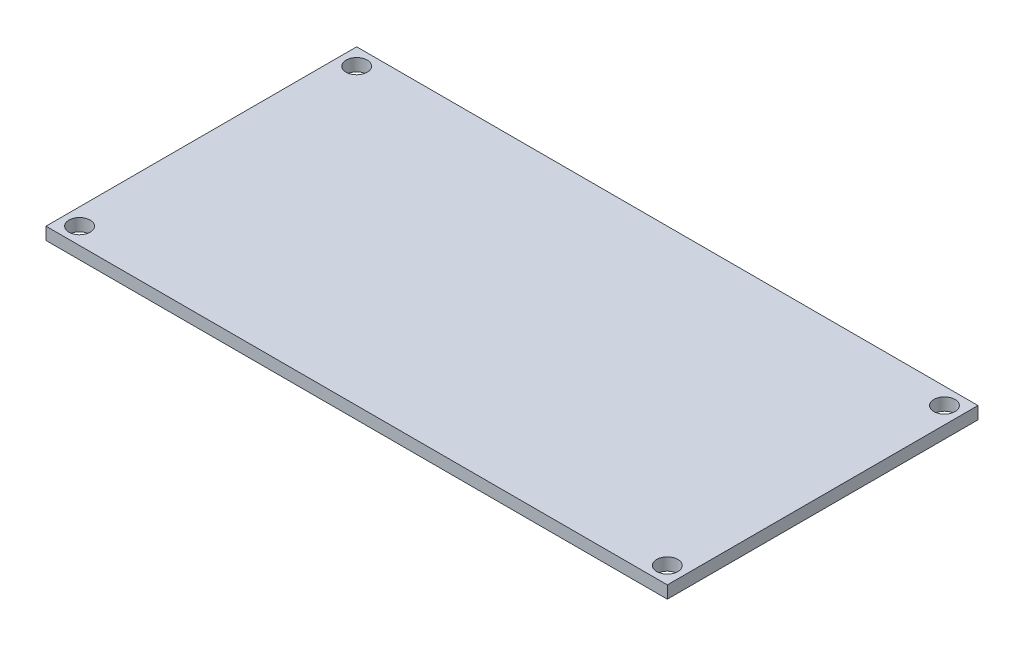
ISO-10303-21;
HEADER;
FILE_DESCRIPTION(('STEP AP214'),'2;1');
FILE_NAME('part.step','',(''),(''),'','','');
FILE_SCHEMA(('AUTOMOTIVE_DESIGN { 1 0 10303 214 1 1 1 1 }'));
ENDSEC;
DATA;
#1=APPLICATION_CONTEXT('core data for automotive mechanical design processes');
#2=APPLICATION_PROTOCOL_DEFINITION('international standard','automotive_design',2000,#1);
#3=PRODUCT_CONTEXT('',#1,'mechanical');
#4=PRODUCT('Part','Part','',(#3));
#5=PRODUCT_RELATED_PRODUCT_CATEGORY('part','',(#4));
#6=PRODUCT_DEFINITION_FORMATION('','',#4);
#7=PRODUCT_DEFINITION_CONTEXT('part definition',#1,'design');
#8=PRODUCT_DEFINITION('design','',#6,#7);
#9=PRODUCT_DEFINITION_SHAPE('','',#8);
#10=(LENGTH_UNIT() NAMED_UNIT(*) SI_UNIT(.MILLI.,.METRE.));
#11=(NAMED_UNIT(*) PLANE_ANGLE_UNIT() SI_UNIT($,.RADIAN.));
#12=(NAMED_UNIT(*) SI_UNIT($,.STERADIAN.) SOLID_ANGLE_UNIT());
#13=UNCERTAINTY_MEASURE_WITH_UNIT(LENGTH_MEASURE(1.E-05),#10,'distance_accuracy_value','');
#14=(GEOMETRIC_REPRESENTATION_CONTEXT(3) GLOBAL_UNCERTAINTY_ASSIGNED_CONTEXT((#13)) GLOBAL_UNIT_ASSIGNED_CONTEXT((#10,
#11,#12)) REPRESENTATION_CONTEXT('',''));
#15=CARTESIAN_POINT('',(0.,0.,0.));
#16=DIRECTION('',(0.,0.,1.));
#17=DIRECTION('',(1.,0.,0.));
#18=AXIS2_PLACEMENT_3D('',#15,#16,#17);
#19=CARTESIAN_POINT('',(-50.,2.,25.));
#20=DIRECTION('',(1.,0.,0.));
#21=DIRECTION('',(0.,0.,-1.));
#22=AXIS2_PLACEMENT_3D('',#19,#20,#21);
#23=PLANE('',#22);
#24=DIRECTION('',(0.,0.,1.));
#25=VECTOR('',#24,1.);
#26=CARTESIAN_POINT('',(-50.,0.,25.));
#27=LINE('',#26,#25);
#28=CARTESIAN_POINT('',(-50.,0.,-25.));
#29=VERTEX_POINT('',#28);
#30=CARTESIAN_POINT('',(-50.,0.,25.));
#31=VERTEX_POINT('',#30);
#32=EDGE_CURVE('E101',#29,#31,#27,.T.);
#33=ORIENTED_EDGE('',*,*,#32,.T.);
#34=DIRECTION('',(0.,-1.,0.));
#35=VECTOR('',#34,1.);
#36=CARTESIAN_POINT('',(-50.,2.,25.));
#37=LINE('',#36,#35);
#38=CARTESIAN_POINT('',(-50.,2.,25.));
#39=VERTEX_POINT('',#38);
#40=EDGE_CURVE('E11',#39,#31,#37,.T.);
#41=ORIENTED_EDGE('',*,*,#40,.F.);
#42=DIRECTION('',(0.,0.,1.));
#43=VECTOR('',#42,1.);
#44=CARTESIAN_POINT('',(-50.,2.,25.));
#45=LINE('',#44,#43);
#46=CARTESIAN_POINT('',(-50.,2.,-25.));
#47=VERTEX_POINT('',#46);
#48=EDGE_CURVE('E89',#47,#39,#45,.T.);
#49=ORIENTED_EDGE('',*,*,#48,.F.);
#50=DIRECTION('',(0.,-1.,0.));
#51=VECTOR('',#50,1.);
#52=CARTESIAN_POINT('',(-50.,2.,-25.));
#53=LINE('',#52,#51);
#54=EDGE_CURVE('E97',#47,#29,#53,.T.);
#55=ORIENTED_EDGE('',*,*,#54,.T.);
#56=EDGE_LOOP('',(#33,#41,#49,#55));
#57=FACE_BOUND('',#56,.T.);
#58=ADVANCED_FACE('F38',(#57),#23,.F.);
#59=CARTESIAN_POINT('',(50.,2.,25.));
#60=DIRECTION('',(0.,0.,-1.));
#61=DIRECTION('',(-1.,0.,0.));
#62=AXIS2_PLACEMENT_3D('',#59,#60,#61);
#63=PLANE('',#62);
#64=DIRECTION('',(1.,0.,0.));
#65=VECTOR('',#64,1.);
#66=CARTESIAN_POINT('',(50.,0.,25.));
#67=LINE('',#66,#65);
#68=CARTESIAN_POINT('',(50.,0.,25.));
#69=VERTEX_POINT('',#68);
#70=EDGE_CURVE('E93',#31,#69,#67,.T.);
#71=ORIENTED_EDGE('',*,*,#70,.T.);
#72=DIRECTION('',(0.,-1.,0.));
#73=VECTOR('',#72,1.);
#74=CARTESIAN_POINT('',(50.,2.,25.));
#75=LINE('',#74,#73);
#76=CARTESIAN_POINT('',(50.,2.,25.));
#77=VERTEX_POINT('',#76);
#78=EDGE_CURVE('E46',#77,#69,#75,.T.);
#79=ORIENTED_EDGE('',*,*,#78,.F.);
#80=DIRECTION('',(1.,0.,0.));
#81=VECTOR('',#80,1.);
#82=CARTESIAN_POINT('',(50.,2.,25.));
#83=LINE('',#82,#81);
#84=EDGE_CURVE('E84',#39,#77,#83,.T.);
#85=ORIENTED_EDGE('',*,*,#84,.F.);
#86=ORIENTED_EDGE('',*,*,#40,.T.);
#87=EDGE_LOOP('',(#71,#79,#85,#86));
#88=FACE_BOUND('',#87,.T.);
#89=ADVANCED_FACE('F92',(#88),#63,.F.);
#90=CARTESIAN_POINT('',(50.,2.,25.));
#91=DIRECTION('',(-1.,0.,0.));
#92=DIRECTION('',(0.,0.,1.));
#93=AXIS2_PLACEMENT_3D('',#90,#91,#92);
#94=PLANE('',#93);
#95=DIRECTION('',(0.,0.,-1.));
#96=VECTOR('',#95,1.);
#97=CARTESIAN_POINT('',(50.,0.,25.));
#98=LINE('',#97,#96);
#99=CARTESIAN_POINT('',(50.,0.,-25.));
#100=VERTEX_POINT('',#99);
#101=EDGE_CURVE('E71',#69,#100,#98,.T.);
#102=ORIENTED_EDGE('',*,*,#101,.T.);
#103=DIRECTION('',(0.,-1.,0.));
#104=VECTOR('',#103,1.);
#105=CARTESIAN_POINT('',(50.,2.,-25.));
#106=LINE('',#105,#104);
#107=CARTESIAN_POINT('',(50.,2.,-25.));
#108=VERTEX_POINT('',#107);
#109=EDGE_CURVE('E94',#108,#100,#106,.T.);
#110=ORIENTED_EDGE('',*,*,#109,.F.);
#111=DIRECTION('',(0.,0.,-1.));
#112=VECTOR('',#111,1.);
#113=CARTESIAN_POINT('',(50.,2.,25.));
#114=LINE('',#113,#112);
#115=EDGE_CURVE('E87',#77,#108,#114,.T.);
#116=ORIENTED_EDGE('',*,*,#115,.F.);
#117=ORIENTED_EDGE('',*,*,#78,.T.);
#118=EDGE_LOOP('',(#102,#110,#116,#117));
#119=FACE_BOUND('',#118,.T.);
#120=ADVANCED_FACE('F95',(#119),#94,.F.);
#121=CARTESIAN_POINT('',(50.,2.,-25.));
#122=DIRECTION('',(0.,0.,1.));
#123=DIRECTION('',(1.,0.,0.));
#124=AXIS2_PLACEMENT_3D('',#121,#122,#123);
#125=PLANE('',#124);
#126=DIRECTION('',(-1.,0.,0.));
#127=VECTOR('',#126,1.);
#128=CARTESIAN_POINT('',(50.,0.,-25.));
#129=LINE('',#128,#127);
#130=EDGE_CURVE('E77',#100,#29,#129,.T.);
#131=ORIENTED_EDGE('',*,*,#130,.T.);
#132=ORIENTED_EDGE('',*,*,#54,.F.);
#133=DIRECTION('',(-1.,0.,0.));
#134=VECTOR('',#133,1.);
#135=CARTESIAN_POINT('',(50.,2.,-25.));
#136=LINE('',#135,#134);
#137=EDGE_CURVE('E54',#108,#47,#136,.T.);
#138=ORIENTED_EDGE('',*,*,#137,.F.);
#139=ORIENTED_EDGE('',*,*,#109,.T.);
#140=EDGE_LOOP('',(#131,#132,#138,#139));
#141=FACE_BOUND('',#140,.T.);
#142=ADVANCED_FACE('F109',(#141),#125,.F.);
#143=CARTESIAN_POINT('',(0.,2.,0.));
#144=DIRECTION('',(0.,1.,0.));
#145=DIRECTION('',(0.,0.,1.));
#146=AXIS2_PLACEMENT_3D('',#143,#144,#145);
#147=PLANE('',#146);
#148=CARTESIAN_POINT('',(47.3,2.,22.3));
#149=DIRECTION('',(0.,1.,0.));
#150=DIRECTION('',(0.,0.,-1.));
#151=AXIS2_PLACEMENT_3D('',#148,#149,#150);
#152=CIRCLE('',#151,1.70000000000001);
#153=CARTESIAN_POINT('',(47.3,2.,20.6));
#154=VERTEX_POINT('',#153);
#155=EDGE_CURVE('E133',#154,#154,#152,.T.);
#156=ORIENTED_EDGE('',*,*,#155,.F.);
#157=EDGE_LOOP('',(#156));
#158=FACE_BOUND('',#157,.T.);
#159=CARTESIAN_POINT('',(-47.3,2.,22.3));
#160=DIRECTION('',(0.,1.,0.));
#161=DIRECTION('',(0.,0.,1.));
#162=AXIS2_PLACEMENT_3D('',#159,#160,#161);
#163=CIRCLE('',#162,1.70000000000001);
#164=CARTESIAN_POINT('',(-47.3,2.,24.));
#165=VERTEX_POINT('',#164);
#166=EDGE_CURVE('E127',#165,#165,#163,.T.);
#167=ORIENTED_EDGE('',*,*,#166,.F.);
#168=EDGE_LOOP('',(#167));
#169=FACE_BOUND('',#168,.T.);
#170=CARTESIAN_POINT('',(-47.3,2.,-22.3));
#171=DIRECTION('',(0.,1.,0.));
#172=DIRECTION('',(0.,0.,-1.));
#173=AXIS2_PLACEMENT_3D('',#170,#171,#172);
#174=CIRCLE('',#173,1.70000000000001);
#175=CARTESIAN_POINT('',(-47.3,2.,-24.));
#176=VERTEX_POINT('',#175);
#177=EDGE_CURVE('E121',#176,#176,#174,.T.);
#178=ORIENTED_EDGE('',*,*,#177,.F.);
#179=EDGE_LOOP('',(#178));
#180=FACE_BOUND('',#179,.T.);
#181=CARTESIAN_POINT('',(47.3,2.,-22.3));
#182=DIRECTION('',(0.,1.,0.));
#183=DIRECTION('',(0.,0.,1.));
#184=AXIS2_PLACEMENT_3D('',#181,#182,#183);
#185=CIRCLE('',#184,1.70000000000001);
#186=CARTESIAN_POINT('',(47.3,2.,-20.6));
#187=VERTEX_POINT('',#186);
#188=EDGE_CURVE('E115',#187,#187,#185,.T.);
#189=ORIENTED_EDGE('',*,*,#188,.F.);
#190=EDGE_LOOP('',(#189));
#191=FACE_BOUND('',#190,.T.);
#192=ORIENTED_EDGE('',*,*,#48,.T.);
#193=ORIENTED_EDGE('',*,*,#84,.T.);
#194=ORIENTED_EDGE('',*,*,#115,.T.);
#195=ORIENTED_EDGE('',*,*,#137,.T.);
#196=EDGE_LOOP('',(#192,#193,#194,#195));
#197=FACE_BOUND('',#196,.T.);
#198=ADVANCED_FACE('F85',(#158,#169,#180,#191,#197),#147,.T.);
#199=CARTESIAN_POINT('',(0.,0.,0.));
#200=DIRECTION('',(0.,1.,0.));
#201=DIRECTION('',(0.,0.,1.));
#202=AXIS2_PLACEMENT_3D('',#199,#200,#201);
#203=PLANE('',#202);
#204=CARTESIAN_POINT('',(47.3,0.,22.3));
#205=DIRECTION('',(0.,1.,0.));
#206=DIRECTION('',(0.,0.,-1.));
#207=AXIS2_PLACEMENT_3D('',#204,#205,#206);
#208=CIRCLE('',#207,1.70000000000001);
#209=CARTESIAN_POINT('',(47.3,0.,20.6));
#210=VERTEX_POINT('',#209);
#211=EDGE_CURVE('E118',#210,#210,#208,.T.);
#212=ORIENTED_EDGE('',*,*,#211,.T.);
#213=EDGE_LOOP('',(#212));
#214=FACE_BOUND('',#213,.T.);
#215=CARTESIAN_POINT('',(-47.3,0.,22.3));
#216=DIRECTION('',(0.,1.,0.));
#217=DIRECTION('',(0.,0.,1.));
#218=AXIS2_PLACEMENT_3D('',#215,#216,#217);
#219=CIRCLE('',#218,1.70000000000001);
#220=CARTESIAN_POINT('',(-47.3,0.,24.));
#221=VERTEX_POINT('',#220);
#222=EDGE_CURVE('E130',#221,#221,#219,.T.);
#223=ORIENTED_EDGE('',*,*,#222,.T.);
#224=EDGE_LOOP('',(#223));
#225=FACE_BOUND('',#224,.T.);
#226=CARTESIAN_POINT('',(-47.3,0.,-22.3));
#227=DIRECTION('',(0.,1.,0.));
#228=DIRECTION('',(0.,0.,-1.));
#229=AXIS2_PLACEMENT_3D('',#226,#227,#228);
#230=CIRCLE('',#229,1.70000000000001);
#231=CARTESIAN_POINT('',(-47.3,0.,-24.));
#232=VERTEX_POINT('',#231);
#233=EDGE_CURVE('E124',#232,#232,#230,.T.);
#234=ORIENTED_EDGE('',*,*,#233,.T.);
#235=EDGE_LOOP('',(#234));
#236=FACE_BOUND('',#235,.T.);
#237=CARTESIAN_POINT('',(47.3,0.,-22.3));
#238=DIRECTION('',(0.,1.,0.));
#239=DIRECTION('',(0.,0.,1.));
#240=AXIS2_PLACEMENT_3D('',#237,#238,#239);
#241=CIRCLE('',#240,1.70000000000001);
#242=CARTESIAN_POINT('',(47.3,0.,-20.6));
#243=VERTEX_POINT('',#242);
#244=EDGE_CURVE('E104',#243,#243,#241,.T.);
#245=ORIENTED_EDGE('',*,*,#244,.T.);
#246=EDGE_LOOP('',(#245));
#247=FACE_BOUND('',#246,.T.);
#248=ORIENTED_EDGE('',*,*,#32,.F.);
#249=ORIENTED_EDGE('',*,*,#130,.F.);
#250=ORIENTED_EDGE('',*,*,#101,.F.);
#251=ORIENTED_EDGE('',*,*,#70,.F.);
#252=EDGE_LOOP('',(#248,#249,#250,#251));
#253=FACE_BOUND('',#252,.T.);
#254=ADVANCED_FACE('F112',(#214,#225,#236,#247,#253),#203,.F.);
#255=CARTESIAN_POINT('',(47.3,0.,-22.3));
#256=DIRECTION('',(0.,1.,0.));
#257=DIRECTION('',(0.,0.,1.));
#258=AXIS2_PLACEMENT_3D('',#255,#256,#257);
#259=CYLINDRICAL_SURFACE('',#258,1.70000000000001);
#260=ORIENTED_EDGE('',*,*,#244,.F.);
#261=EDGE_LOOP('',(#260));
#262=FACE_BOUND('',#261,.T.);
#263=ORIENTED_EDGE('',*,*,#188,.T.);
#264=EDGE_LOOP('',(#263));
#265=FACE_BOUND('',#264,.T.);
#266=ADVANCED_FACE('F157',(#262,#265),#259,.F.);
#267=CARTESIAN_POINT('',(-47.3,0.,-22.3));
#268=DIRECTION('',(0.,1.,0.));
#269=DIRECTION('',(0.,0.,1.));
#270=AXIS2_PLACEMENT_3D('',#267,#268,#269);
#271=CYLINDRICAL_SURFACE('',#270,1.70000000000001);
#272=ORIENTED_EDGE('',*,*,#233,.F.);
#273=EDGE_LOOP('',(#272));
#274=FACE_BOUND('',#273,.T.);
#275=ORIENTED_EDGE('',*,*,#177,.T.);
#276=EDGE_LOOP('',(#275));
#277=FACE_BOUND('',#276,.T.);
#278=ADVANCED_FACE('F159',(#274,#277),#271,.F.);
#279=CARTESIAN_POINT('',(-47.3,0.,22.3));
#280=DIRECTION('',(0.,1.,0.));
#281=DIRECTION('',(0.,0.,1.));
#282=AXIS2_PLACEMENT_3D('',#279,#280,#281);
#283=CYLINDRICAL_SURFACE('',#282,1.70000000000001);
#284=ORIENTED_EDGE('',*,*,#222,.F.);
#285=EDGE_LOOP('',(#284));
#286=FACE_BOUND('',#285,.T.);
#287=ORIENTED_EDGE('',*,*,#166,.T.);
#288=EDGE_LOOP('',(#287));
#289=FACE_BOUND('',#288,.T.);
#290=ADVANCED_FACE('F144',(#286,#289),#283,.F.);
#291=CARTESIAN_POINT('',(47.3,0.,22.3));
#292=DIRECTION('',(0.,1.,0.));
#293=DIRECTION('',(0.,0.,1.));
#294=AXIS2_PLACEMENT_3D('',#291,#292,#293);
#295=CYLINDRICAL_SURFACE('',#294,1.70000000000001);
#296=ORIENTED_EDGE('',*,*,#211,.F.);
#297=EDGE_LOOP('',(#296));
#298=FACE_BOUND('',#297,.T.);
#299=ORIENTED_EDGE('',*,*,#155,.T.);
#300=EDGE_LOOP('',(#299));
#301=FACE_BOUND('',#300,.T.);
#302=ADVANCED_FACE('F141',(#298,#301),#295,.F.);
#303=CLOSED_SHELL('',(#58,#89,#120,#142,#198,#254,#266,#278,#290,#302));
#304=MANIFOLD_SOLID_BREP('B2',#303);
#305=ADVANCED_BREP_SHAPE_REPRESENTATION('',(#18,#304),#14);
#306=SHAPE_DEFINITION_REPRESENTATION(#9,#305);
ENDSEC;
END-ISO-10303-21;
